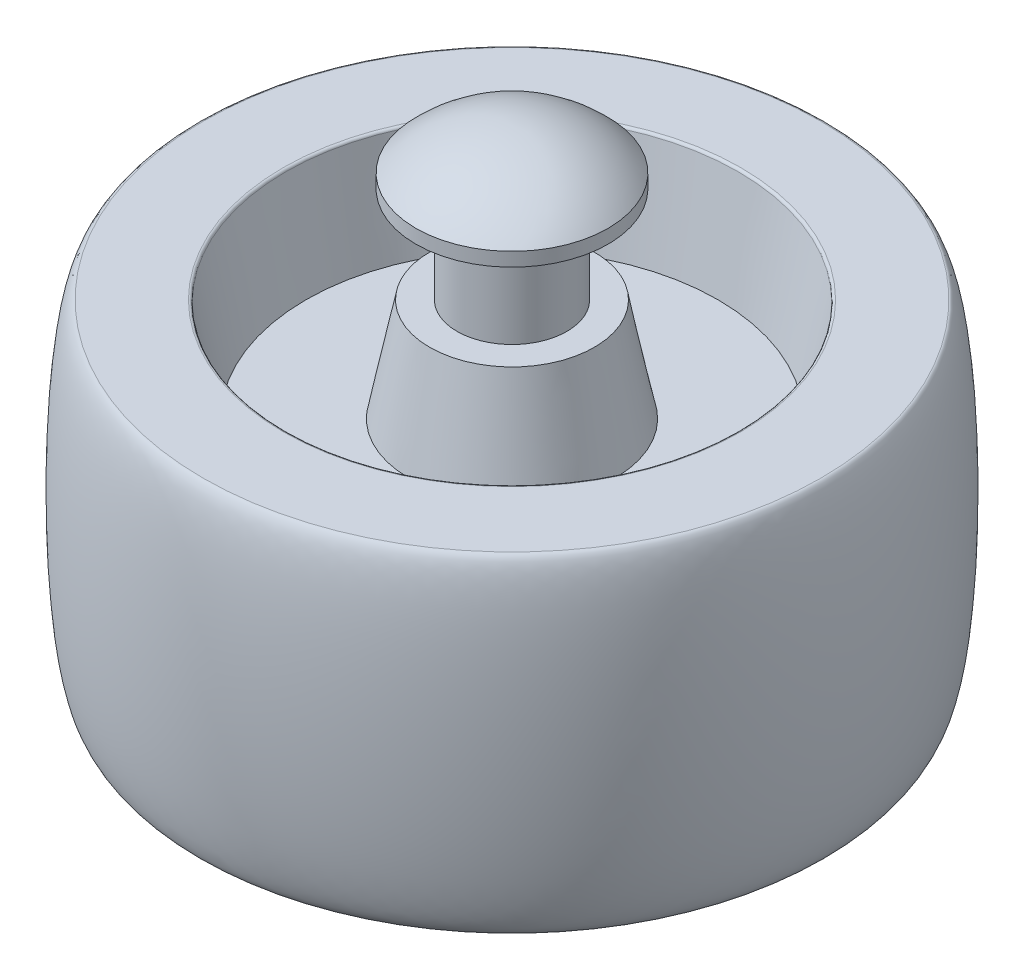
ISO-10303-21;
HEADER;
FILE_DESCRIPTION(('STEP AP214'),'2;1');
FILE_NAME('part.step','',(''),(''),'','','');
FILE_SCHEMA(('AUTOMOTIVE_DESIGN { 1 0 10303 214 1 1 1 1 }'));
ENDSEC;
DATA;
#1=APPLICATION_CONTEXT('core data for automotive mechanical design processes');
#2=APPLICATION_PROTOCOL_DEFINITION('international standard','automotive_design',2000,#1);
#3=PRODUCT_CONTEXT('',#1,'mechanical');
#4=PRODUCT('Part','Part','',(#3));
#5=PRODUCT_RELATED_PRODUCT_CATEGORY('part','',(#4));
#6=PRODUCT_DEFINITION_FORMATION('','',#4);
#7=PRODUCT_DEFINITION_CONTEXT('part definition',#1,'design');
#8=PRODUCT_DEFINITION('design','',#6,#7);
#9=PRODUCT_DEFINITION_SHAPE('','',#8);
#10=(LENGTH_UNIT() NAMED_UNIT(*) SI_UNIT(.MILLI.,.METRE.));
#11=(NAMED_UNIT(*) PLANE_ANGLE_UNIT() SI_UNIT($,.RADIAN.));
#12=(NAMED_UNIT(*) SI_UNIT($,.STERADIAN.) SOLID_ANGLE_UNIT());
#13=UNCERTAINTY_MEASURE_WITH_UNIT(LENGTH_MEASURE(1.E-05),#10,'distance_accuracy_value','');
#14=(GEOMETRIC_REPRESENTATION_CONTEXT(3) GLOBAL_UNCERTAINTY_ASSIGNED_CONTEXT((#13)) GLOBAL_UNIT_ASSIGNED_CONTEXT((#10,
#11,#12)) REPRESENTATION_CONTEXT('',''));
#15=CARTESIAN_POINT('',(0.,0.,0.));
#16=DIRECTION('',(0.,0.,1.));
#17=DIRECTION('',(1.,0.,0.));
#18=AXIS2_PLACEMENT_3D('',#15,#16,#17);
#19=CARTESIAN_POINT('',(0.,6.,0.));
#20=DIRECTION('',(0.,-1.,0.));
#21=DIRECTION('',(0.,0.,-1.));
#22=AXIS2_PLACEMENT_3D('',#19,#20,#21);
#23=PLANE('',#22);
#24=CARTESIAN_POINT('',(0.,6.,0.));
#25=DIRECTION('',(0.,1.,0.));
#26=DIRECTION('',(0.,0.,1.));
#27=AXIS2_PLACEMENT_3D('',#24,#25,#26);
#28=CIRCLE('',#27,2.);
#29=CARTESIAN_POINT('',(0.,6.,2.));
#30=VERTEX_POINT('',#29);
#31=EDGE_CURVE('E89',#30,#30,#28,.T.);
#32=ORIENTED_EDGE('',*,*,#31,.F.);
#33=EDGE_LOOP('',(#32));
#34=FACE_BOUND('',#33,.T.);
#35=CARTESIAN_POINT('',(0.,6.,0.));
#36=DIRECTION('',(0.,1.,0.));
#37=DIRECTION('',(0.,0.,1.));
#38=AXIS2_PLACEMENT_3D('',#35,#36,#37);
#39=CIRCLE('',#38,3.);
#40=CARTESIAN_POINT('',(0.,6.,3.));
#41=VERTEX_POINT('',#40);
#42=EDGE_CURVE('E86',#41,#41,#39,.T.);
#43=ORIENTED_EDGE('',*,*,#42,.T.);
#44=EDGE_LOOP('',(#43));
#45=FACE_BOUND('',#44,.T.);
#46=ADVANCED_FACE('F30',(#34,#45),#23,.F.);
#47=CARTESIAN_POINT('',(0.,-6.,0.));
#48=DIRECTION('',(0.,1.,0.));
#49=DIRECTION('',(0.,0.,1.));
#50=AXIS2_PLACEMENT_3D('',#47,#48,#49);
#51=PLANE('',#50);
#52=CARTESIAN_POINT('',(0.,-6.,0.));
#53=DIRECTION('',(0.,1.,0.));
#54=DIRECTION('',(0.,0.,1.));
#55=AXIS2_PLACEMENT_3D('',#52,#53,#54);
#56=CIRCLE('',#55,2.);
#57=CARTESIAN_POINT('',(0.,-6.,2.));
#58=VERTEX_POINT('',#57);
#59=EDGE_CURVE('E360',#58,#58,#56,.T.);
#60=ORIENTED_EDGE('',*,*,#59,.T.);
#61=EDGE_LOOP('',(#60));
#62=FACE_BOUND('',#61,.T.);
#63=CARTESIAN_POINT('',(0.,-6.,0.));
#64=DIRECTION('',(0.,1.,0.));
#65=DIRECTION('',(0.,0.,1.));
#66=AXIS2_PLACEMENT_3D('',#63,#64,#65);
#67=CIRCLE('',#66,3.);
#68=CARTESIAN_POINT('',(0.,-6.,3.));
#69=VERTEX_POINT('',#68);
#70=EDGE_CURVE('E65',#69,#69,#67,.T.);
#71=ORIENTED_EDGE('',*,*,#70,.F.);
#72=EDGE_LOOP('',(#71));
#73=FACE_BOUND('',#72,.T.);
#74=ADVANCED_FACE('F116',(#62,#73),#51,.F.);
#75=CARTESIAN_POINT('',(0.,-6.,0.));
#76=DIRECTION('',(0.,1.,0.));
#77=DIRECTION('',(0.,0.,1.));
#78=AXIS2_PLACEMENT_3D('',#75,#76,#77);
#79=CONICAL_SURFACE('',#78,3.,0.197395559849882);
#80=CARTESIAN_POINT('',(0.,-2.25,0.));
#81=DIRECTION('',(0.,1.,0.));
#82=DIRECTION('',(0.,0.,1.));
#83=AXIS2_PLACEMENT_3D('',#80,#81,#82);
#84=CIRCLE('',#83,3.75);
#85=CARTESIAN_POINT('',(0.,-2.25,3.75));
#86=VERTEX_POINT('',#85);
#87=EDGE_CURVE('E68',#86,#86,#84,.T.);
#88=ORIENTED_EDGE('',*,*,#87,.F.);
#89=EDGE_LOOP('',(#88));
#90=FACE_BOUND('',#89,.T.);
#91=ORIENTED_EDGE('',*,*,#70,.T.);
#92=EDGE_LOOP('',(#91));
#93=FACE_BOUND('',#92,.T.);
#94=ADVANCED_FACE('F112',(#90,#93),#79,.T.);
#95=CARTESIAN_POINT('',(3.75,-2.25,0.));
#96=DIRECTION('',(0.,1.,0.));
#97=DIRECTION('',(0.,0.,1.));
#98=AXIS2_PLACEMENT_3D('',#95,#96,#97);
#99=PLANE('',#98);
#100=CARTESIAN_POINT('',(0.,-2.25,0.));
#101=DIRECTION('',(0.,1.,0.));
#102=DIRECTION('',(0.,0.,1.));
#103=AXIS2_PLACEMENT_3D('',#100,#101,#102);
#104=CIRCLE('',#103,7.5);
#105=CARTESIAN_POINT('',(0.,-2.25,7.5));
#106=VERTEX_POINT('',#105);
#107=EDGE_CURVE('E71',#106,#106,#104,.T.);
#108=ORIENTED_EDGE('',*,*,#107,.F.);
#109=EDGE_LOOP('',(#108));
#110=FACE_BOUND('',#109,.T.);
#111=ORIENTED_EDGE('',*,*,#87,.T.);
#112=EDGE_LOOP('',(#111));
#113=FACE_BOUND('',#112,.T.);
#114=ADVANCED_FACE('F108',(#110,#113),#99,.F.);
#115=CARTESIAN_POINT('',(0.,-2.25,0.));
#116=DIRECTION('',(0.,-1.,0.));
#117=DIRECTION('',(0.,0.,-1.));
#118=AXIS2_PLACEMENT_3D('',#115,#116,#117);
#119=CONICAL_SURFACE('',#118,7.5,0.197395559849881);
#120=CARTESIAN_POINT('',(0.,-5.91961161351381,0.));
#121=DIRECTION('',(0.,1.,0.));
#122=DIRECTION('',(0.,0.,1.));
#123=AXIS2_PLACEMENT_3D('',#120,#121,#122);
#124=CIRCLE('',#123,8.23392232270276);
#125=CARTESIAN_POINT('',(0.,-5.91961161351381,8.23392232270276));
#126=VERTEX_POINT('',#125);
#127=EDGE_CURVE('E59',#126,#126,#124,.F.);
#128=ORIENTED_EDGE('',*,*,#127,.T.);
#129=EDGE_LOOP('',(#128));
#130=FACE_BOUND('',#129,.T.);
#131=ORIENTED_EDGE('',*,*,#107,.T.);
#132=EDGE_LOOP('',(#131));
#133=FACE_BOUND('',#132,.T.);
#134=ADVANCED_FACE('F104',(#130,#133),#119,.F.);
#135=CARTESIAN_POINT('',(8.25,-6.,0.));
#136=DIRECTION('',(0.,1.,0.));
#137=DIRECTION('',(0.,0.,1.));
#138=AXIS2_PLACEMENT_3D('',#135,#136,#137);
#139=PLANE('',#138);
#140=CARTESIAN_POINT('',(0.,-6.,0.));
#141=DIRECTION('',(0.,1.,0.));
#142=DIRECTION('',(0.,0.,1.));
#143=AXIS2_PLACEMENT_3D('',#140,#141,#142);
#144=CIRCLE('',#143,8.33198039027185);
#145=CARTESIAN_POINT('',(0.,-6.,8.33198039027185));
#146=VERTEX_POINT('',#145);
#147=EDGE_CURVE('E62',#146,#146,#144,.T.);
#148=ORIENTED_EDGE('',*,*,#147,.T.);
#149=EDGE_LOOP('',(#148));
#150=FACE_BOUND('',#149,.T.);
#151=CARTESIAN_POINT('',(0.,-6.,0.));
#152=DIRECTION('',(0.,1.,0.));
#153=DIRECTION('',(0.,0.,1.));
#154=AXIS2_PLACEMENT_3D('',#151,#152,#153);
#155=CIRCLE('',#154,11.25);
#156=CARTESIAN_POINT('',(0.,-6.,11.25));
#157=VERTEX_POINT('',#156);
#158=EDGE_CURVE('E74',#157,#157,#155,.T.);
#159=ORIENTED_EDGE('',*,*,#158,.F.);
#160=EDGE_LOOP('',(#159));
#161=FACE_BOUND('',#160,.T.);
#162=ADVANCED_FACE('F99',(#150,#161),#139,.F.);
#163=CARTESIAN_POINT('',(11.25,0.,0.));
#164=DIRECTION('',(0.,0.,1.));
#165=DIRECTION('',(0.,1.,0.));
#166=AXIS2_PLACEMENT_3D('',#163,#164,#165);
#167=ELLIPSE('',#166,6.,0.750000000000001);
#168=CARTESIAN_POINT('',(0.,6.,0.));
#169=DIRECTION('',(0.,1.,0.));
#170=AXIS1_PLACEMENT('',#168,#169);
#171=SURFACE_OF_REVOLUTION('',#167,#170);
#172=CARTESIAN_POINT('',(0.,6.,0.));
#173=DIRECTION('',(0.,1.,0.));
#174=DIRECTION('',(0.,0.,1.));
#175=AXIS2_PLACEMENT_3D('',#172,#173,#174);
#176=CIRCLE('',#175,11.25);
#177=CARTESIAN_POINT('',(0.,6.,11.25));
#178=VERTEX_POINT('',#177);
#179=EDGE_CURVE('E77',#178,#178,#176,.T.);
#180=ORIENTED_EDGE('',*,*,#179,.F.);
#181=EDGE_LOOP('',(#180));
#182=FACE_BOUND('',#181,.T.);
#183=ORIENTED_EDGE('',*,*,#158,.T.);
#184=EDGE_LOOP('',(#183));
#185=FACE_BOUND('',#184,.T.);
#186=ADVANCED_FACE('F94',(#182,#185),#171,.T.);
#187=CARTESIAN_POINT('',(8.25,6.,0.));
#188=DIRECTION('',(0.,-1.,0.));
#189=DIRECTION('',(0.,0.,-1.));
#190=AXIS2_PLACEMENT_3D('',#187,#188,#189);
#191=PLANE('',#190);
#192=CARTESIAN_POINT('',(0.,6.,0.));
#193=DIRECTION('',(0.,-1.,0.));
#194=DIRECTION('',(0.,0.,-1.));
#195=AXIS2_PLACEMENT_3D('',#192,#193,#194);
#196=CIRCLE('',#195,8.33198039027186);
#197=CARTESIAN_POINT('',(0.,6.,-8.33198039027186));
#198=VERTEX_POINT('',#197);
#199=EDGE_CURVE('E53',#198,#198,#196,.T.);
#200=ORIENTED_EDGE('',*,*,#199,.T.);
#201=EDGE_LOOP('',(#200));
#202=FACE_BOUND('',#201,.T.);
#203=ORIENTED_EDGE('',*,*,#179,.T.);
#204=EDGE_LOOP('',(#203));
#205=FACE_BOUND('',#204,.T.);
#206=ADVANCED_FACE('F98',(#202,#205),#191,.F.);
#207=CARTESIAN_POINT('',(0.,6.,0.));
#208=DIRECTION('',(0.,1.,0.));
#209=DIRECTION('',(0.,0.,1.));
#210=AXIS2_PLACEMENT_3D('',#207,#208,#209);
#211=CONICAL_SURFACE('',#210,8.25,0.197395559849881);
#212=CARTESIAN_POINT('',(0.,5.91961161351381,0.));
#213=DIRECTION('',(0.,-1.,0.));
#214=DIRECTION('',(0.,0.,-1.));
#215=AXIS2_PLACEMENT_3D('',#212,#213,#214);
#216=CIRCLE('',#215,8.23392232270277);
#217=CARTESIAN_POINT('',(0.,5.91961161351381,-8.23392232270277));
#218=VERTEX_POINT('',#217);
#219=EDGE_CURVE('E56',#218,#218,#216,.F.);
#220=ORIENTED_EDGE('',*,*,#219,.T.);
#221=EDGE_LOOP('',(#220));
#222=FACE_BOUND('',#221,.T.);
#223=CARTESIAN_POINT('',(0.,2.25,0.));
#224=DIRECTION('',(0.,1.,0.));
#225=DIRECTION('',(0.,0.,1.));
#226=AXIS2_PLACEMENT_3D('',#223,#224,#225);
#227=CIRCLE('',#226,7.5);
#228=CARTESIAN_POINT('',(0.,2.25,7.5));
#229=VERTEX_POINT('',#228);
#230=EDGE_CURVE('E80',#229,#229,#227,.T.);
#231=ORIENTED_EDGE('',*,*,#230,.F.);
#232=EDGE_LOOP('',(#231));
#233=FACE_BOUND('',#232,.T.);
#234=ADVANCED_FACE('F186',(#222,#233),#211,.F.);
#235=CARTESIAN_POINT('',(3.75,2.25,0.));
#236=DIRECTION('',(0.,-1.,0.));
#237=DIRECTION('',(0.,0.,-1.));
#238=AXIS2_PLACEMENT_3D('',#235,#236,#237);
#239=PLANE('',#238);
#240=CARTESIAN_POINT('',(0.,2.25,0.));
#241=DIRECTION('',(0.,1.,0.));
#242=DIRECTION('',(0.,0.,1.));
#243=AXIS2_PLACEMENT_3D('',#240,#241,#242);
#244=CIRCLE('',#243,3.75);
#245=CARTESIAN_POINT('',(0.,2.25,3.75));
#246=VERTEX_POINT('',#245);
#247=EDGE_CURVE('E83',#246,#246,#244,.T.);
#248=ORIENTED_EDGE('',*,*,#247,.F.);
#249=EDGE_LOOP('',(#248));
#250=FACE_BOUND('',#249,.T.);
#251=ORIENTED_EDGE('',*,*,#230,.T.);
#252=EDGE_LOOP('',(#251));
#253=FACE_BOUND('',#252,.T.);
#254=ADVANCED_FACE('F183',(#250,#253),#239,.F.);
#255=CARTESIAN_POINT('',(0.,2.25,0.));
#256=DIRECTION('',(0.,-1.,0.));
#257=DIRECTION('',(0.,0.,-1.));
#258=AXIS2_PLACEMENT_3D('',#255,#256,#257);
#259=CONICAL_SURFACE('',#258,3.75,0.197395559849881);
#260=ORIENTED_EDGE('',*,*,#42,.F.);
#261=EDGE_LOOP('',(#260));
#262=FACE_BOUND('',#261,.T.);
#263=ORIENTED_EDGE('',*,*,#247,.T.);
#264=EDGE_LOOP('',(#263));
#265=FACE_BOUND('',#264,.T.);
#266=ADVANCED_FACE('F180',(#262,#265),#259,.T.);
#267=CARTESIAN_POINT('',(0.,-14.8129381414282,0.));
#268=DIRECTION('',(0.,1.,0.));
#269=DIRECTION('',(0.,0.,1.));
#270=AXIS2_PLACEMENT_3D('',#267,#268,#269);
#271=CYLINDRICAL_SURFACE('',#270,2.);
#272=CARTESIAN_POINT('',(0.,-9.15435984030725,0.));
#273=DIRECTION('',(-0.00820676985655671,-0.999390827019096,-0.0339208460774402));
#274=DIRECTION('',(-0.235011140246955,0.034899496702501,-0.971365939844371));
#275=AXIS2_PLACEMENT_3D('',#272,#273,#274);
#276=ELLIPSE('',#275,2.00121908859764,2.);
#277=CARTESIAN_POINT('',(-0.470308779895303,-9.08451830132376,-1.94391606083015));
#278=VERTEX_POINT('',#277);
#279=EDGE_CURVE('E357',#278,#278,#276,.F.);
#280=ORIENTED_EDGE('',*,*,#279,.T.);
#281=EDGE_LOOP('',(#280));
#282=FACE_BOUND('',#281,.T.);
#283=ORIENTED_EDGE('',*,*,#59,.F.);
#284=EDGE_LOOP('',(#283));
#285=FACE_BOUND('',#284,.T.);
#286=ADVANCED_FACE('F177',(#282,#285),#271,.T.);
#287=CARTESIAN_POINT('',(0.,9.5,0.));
#288=DIRECTION('',(0.,1.,0.));
#289=DIRECTION('',(0.,0.,1.));
#290=AXIS2_PLACEMENT_3D('',#287,#288,#289);
#291=CIRCLE('',#290,2.);
#292=CARTESIAN_POINT('',(0.,9.5,2.));
#293=VERTEX_POINT('',#292);
#294=EDGE_CURVE('E361',#293,#293,#291,.T.);
#295=ORIENTED_EDGE('',*,*,#294,.F.);
#296=EDGE_LOOP('',(#295));
#297=FACE_BOUND('',#296,.T.);
#298=ORIENTED_EDGE('',*,*,#31,.T.);
#299=EDGE_LOOP('',(#298));
#300=FACE_BOUND('',#299,.T.);
#301=ADVANCED_FACE('F128',(#297,#300),#271,.T.);
#302=CARTESIAN_POINT('',(0.,-5.9,0.));
#303=DIRECTION('',(0.,1.,0.));
#304=DIRECTION('',(0.,0.,1.));
#305=AXIS2_PLACEMENT_3D('',#302,#303,#304);
#306=TOROIDAL_SURFACE('',#305,8.33198039027185,0.1);
#307=ORIENTED_EDGE('',*,*,#127,.F.);
#308=EDGE_LOOP('',(#307));
#309=FACE_BOUND('',#308,.T.);
#310=ORIENTED_EDGE('',*,*,#147,.F.);
#311=EDGE_LOOP('',(#310));
#312=FACE_BOUND('',#311,.T.);
#313=ADVANCED_FACE('F124',(#309,#312),#306,.T.);
#314=CARTESIAN_POINT('',(0.,5.9,0.));
#315=DIRECTION('',(0.,-1.,0.));
#316=DIRECTION('',(0.,0.,-1.));
#317=AXIS2_PLACEMENT_3D('',#314,#315,#316);
#318=TOROIDAL_SURFACE('',#317,8.33198039027186,0.1);
#319=ORIENTED_EDGE('',*,*,#199,.F.);
#320=EDGE_LOOP('',(#319));
#321=FACE_BOUND('',#320,.T.);
#322=ORIENTED_EDGE('',*,*,#219,.F.);
#323=EDGE_LOOP('',(#322));
#324=FACE_BOUND('',#323,.T.);
#325=ADVANCED_FACE('F127',(#321,#324),#318,.T.);
#326=CARTESIAN_POINT('',(0.,10.,0.));
#327=DIRECTION('',(0.,-1.,0.));
#328=DIRECTION('',(0.,0.,-1.));
#329=AXIS2_PLACEMENT_3D('',#326,#327,#328);
#330=CYLINDRICAL_SURFACE('',#329,3.5);
#331=CARTESIAN_POINT('',(0.,10.,0.));
#332=DIRECTION('',(0.,1.,0.));
#333=DIRECTION('',(0.,0.,1.));
#334=AXIS2_PLACEMENT_3D('',#331,#332,#333);
#335=CIRCLE('',#334,3.5);
#336=CARTESIAN_POINT('',(0.,10.,3.5));
#337=VERTEX_POINT('',#336);
#338=EDGE_CURVE('E364',#337,#337,#335,.T.);
#339=ORIENTED_EDGE('',*,*,#338,.F.);
#340=EDGE_LOOP('',(#339));
#341=FACE_BOUND('',#340,.T.);
#342=CARTESIAN_POINT('',(0.,9.5,0.));
#343=DIRECTION('',(0.,1.,0.));
#344=DIRECTION('',(0.,0.,1.));
#345=AXIS2_PLACEMENT_3D('',#342,#343,#344);
#346=CIRCLE('',#345,3.5);
#347=CARTESIAN_POINT('',(0.,9.5,3.5));
#348=VERTEX_POINT('',#347);
#349=EDGE_CURVE('E367',#348,#348,#346,.T.);
#350=ORIENTED_EDGE('',*,*,#349,.T.);
#351=EDGE_LOOP('',(#350));
#352=FACE_BOUND('',#351,.T.);
#353=ADVANCED_FACE('F131',(#341,#352),#330,.T.);
#354=CARTESIAN_POINT('',(0.,9.5,0.));
#355=DIRECTION('',(0.,1.,0.));
#356=DIRECTION('',(0.,0.,1.));
#357=AXIS2_PLACEMENT_3D('',#354,#355,#356);
#358=PLANE('',#357);
#359=ORIENTED_EDGE('',*,*,#294,.T.);
#360=EDGE_LOOP('',(#359));
#361=FACE_BOUND('',#360,.T.);
#362=ORIENTED_EDGE('',*,*,#349,.F.);
#363=EDGE_LOOP('',(#362));
#364=FACE_BOUND('',#363,.T.);
#365=ADVANCED_FACE('F163',(#361,#364),#358,.F.);
#366=CARTESIAN_POINT('',(0.,6.66666666666666,0.));
#367=DIRECTION('',(0.,-1.,0.));
#368=DIRECTION('',(1.,0.,0.));
#369=AXIS2_PLACEMENT_3D('',#366,#367,#368);
#370=SPHERICAL_SURFACE('',#369,4.83333333333334);
#371=ORIENTED_EDGE('',*,*,#338,.T.);
#372=EDGE_LOOP('',(#371));
#373=FACE_BOUND('',#372,.T.);
#374=ADVANCED_FACE('F152',(#373),#370,.T.);
#375=CARTESIAN_POINT('',(-0.0791853435419678,-9.64290547357956,-0.327294891513296));
#376=DIRECTION('',(-0.00820676985655671,-0.999390827019096,-0.0339208460774402));
#377=DIRECTION('',(0.,0.0339219884378093,-0.99942448374073));
#378=AXIS2_PLACEMENT_3D('',#375,#376,#377);
#379=PLANE('',#378);
#380=CARTESIAN_POINT('',(-0.0791853435419678,-9.64290547357956,-0.327294891513296));
#381=DIRECTION('',(-0.00820676985655671,-0.999390827019096,-0.0339208460774402));
#382=DIRECTION('',(0.,0.0339219884378093,-0.99942448374073));
#383=AXIS2_PLACEMENT_3D('',#380,#381,#382);
#384=CIRCLE('',#383,2.6);
#385=CARTESIAN_POINT('',(-0.0791853435419678,-9.55470830364126,-2.92579854923919));
#386=VERTEX_POINT('',#385);
#387=EDGE_CURVE('E41',#386,#386,#384,.T.);
#388=ORIENTED_EDGE('',*,*,#387,.T.);
#389=EDGE_LOOP('',(#388));
#390=FACE_BOUND('',#389,.T.);
#391=CARTESIAN_POINT('',(-0.0791853435419678,-9.64290547357956,-0.327294891513296));
#392=DIRECTION('',(-0.00820676985655671,-0.999390827019096,-0.0339208460774402));
#393=DIRECTION('',(0.,0.0339219884378093,-0.99942448374073));
#394=AXIS2_PLACEMENT_3D('',#391,#392,#393);
#395=CIRCLE('',#394,1.9);
#396=CARTESIAN_POINT('',(-0.0791853435419678,-9.57845369554773,-2.22620141062068));
#397=VERTEX_POINT('',#396);
#398=EDGE_CURVE('E45',#397,#397,#395,.F.);
#399=ORIENTED_EDGE('',*,*,#398,.T.);
#400=EDGE_LOOP('',(#399));
#401=FACE_BOUND('',#400,.T.);
#402=ADVANCED_FACE('F148',(#390,#401),#379,.T.);
#403=CARTESIAN_POINT('',(-0.0750819586136895,-9.14321006007002,-0.310334468474576));
#404=DIRECTION('',(-0.00820676985655671,-0.999390827019096,-0.0339208460774402));
#405=DIRECTION('',(0.,0.0339219884378093,-0.99942448374073));
#406=AXIS2_PLACEMENT_3D('',#403,#404,#405);
#407=PLANE('',#406);
#408=ORIENTED_EDGE('',*,*,#279,.F.);
#409=EDGE_LOOP('',(#408));
#410=FACE_BOUND('',#409,.T.);
#411=CARTESIAN_POINT('',(-0.0750819586136895,-9.14321006007002,-0.310334468474576));
#412=DIRECTION('',(-0.00820676985655671,-0.999390827019096,-0.0339208460774402));
#413=DIRECTION('',(0.,0.0339219884378093,-0.99942448374073));
#414=AXIS2_PLACEMENT_3D('',#411,#412,#413);
#415=CIRCLE('',#414,3.);
#416=CARTESIAN_POINT('',(-0.0750819586136895,-9.04144409475659,-3.30860791969677));
#417=VERTEX_POINT('',#416);
#418=EDGE_CURVE('E373',#417,#417,#415,.T.);
#419=ORIENTED_EDGE('',*,*,#418,.F.);
#420=EDGE_LOOP('',(#419));
#421=FACE_BOUND('',#420,.T.);
#422=ADVANCED_FACE('F151',(#410,#421),#407,.F.);
#423=CARTESIAN_POINT('',(-0.0791853435419678,-9.64290547357956,-0.327294891513296));
#424=DIRECTION('',(0.00820676985655671,0.999390827019096,0.0339208460774402));
#425=DIRECTION('',(0.,-0.0339219884378093,0.99942448374073));
#426=AXIS2_PLACEMENT_3D('',#423,#424,#425);
#427=CYLINDRICAL_SURFACE('',#426,3.);
#428=CARTESIAN_POINT('',(-0.0759026355993452,-9.24314914277193,-0.31372655308232));
#429=DIRECTION('',(-0.00820676985655671,-0.999390827019096,-0.0339208460774402));
#430=DIRECTION('',(0.,0.0339219884378093,-0.99942448374073));
#431=AXIS2_PLACEMENT_3D('',#428,#429,#430);
#432=CIRCLE('',#431,3.);
#433=CARTESIAN_POINT('',(-0.0759026355993452,-9.1413831774585,-3.31200000430451));
#434=VERTEX_POINT('',#433);
#435=EDGE_CURVE('E37',#434,#434,#432,.F.);
#436=ORIENTED_EDGE('',*,*,#435,.T.);
#437=EDGE_LOOP('',(#436));
#438=FACE_BOUND('',#437,.T.);
#439=ORIENTED_EDGE('',*,*,#418,.T.);
#440=EDGE_LOOP('',(#439));
#441=FACE_BOUND('',#440,.T.);
#442=ADVANCED_FACE('F160',(#438,#441),#427,.T.);
#443=CARTESIAN_POINT('',(-0.0791853435419678,-9.64290547357956,-0.327294891513296));
#444=DIRECTION('',(0.00820676985655671,0.999390827019096,0.0339208460774402));
#445=DIRECTION('',(0.,-0.0339219884378093,0.99942448374073));
#446=AXIS2_PLACEMENT_3D('',#443,#444,#445);
#447=CYLINDRICAL_SURFACE('',#446,1.5);
#448=CARTESIAN_POINT('',(-0.0759026355993452,-9.24314914277193,-0.31372655308232));
#449=DIRECTION('',(-0.00820676985655671,-0.999390827019096,-0.0339208460774402));
#450=DIRECTION('',(0.,0.0339219884378093,-0.99942448374073));
#451=AXIS2_PLACEMENT_3D('',#448,#449,#450);
#452=CIRCLE('',#451,1.5);
#453=CARTESIAN_POINT('',(-0.0759026355993452,-9.19226616011521,-1.81286327869342));
#454=VERTEX_POINT('',#453);
#455=EDGE_CURVE('E10',#454,#454,#452,.T.);
#456=ORIENTED_EDGE('',*,*,#455,.T.);
#457=EDGE_LOOP('',(#456));
#458=FACE_BOUND('',#457,.T.);
#459=CARTESIAN_POINT('',(-0.0750819586136895,-9.14321006007001,-0.310334468474576));
#460=DIRECTION('',(-0.00820676985655671,-0.999390827019096,-0.0339208460774402));
#461=DIRECTION('',(0.,0.0339219884378093,-0.99942448374073));
#462=AXIS2_PLACEMENT_3D('',#459,#460,#461);
#463=CIRCLE('',#462,1.5);
#464=CARTESIAN_POINT('',(-0.0750819586136895,-9.0923270774133,-1.80947119408567));
#465=VERTEX_POINT('',#464);
#466=EDGE_CURVE('E50',#465,#465,#463,.F.);
#467=ORIENTED_EDGE('',*,*,#466,.T.);
#468=EDGE_LOOP('',(#467));
#469=FACE_BOUND('',#468,.T.);
#470=ADVANCED_FACE('F142',(#458,#469),#447,.F.);
#471=CARTESIAN_POINT('',(-0.883756515666599,-8.49725851281503,-19.1459921519001));
#472=DIRECTION('',(-0.00820676985655671,-0.999390827019096,-0.0339208460774402));
#473=DIRECTION('',(-0.235011140246969,0.034899496702501,-0.971365939844368));
#474=AXIS2_PLACEMENT_3D('',#471,#472,#473);
#475=PLANE('',#474);
#476=ORIENTED_EDGE('',*,*,#466,.F.);
#477=EDGE_LOOP('',(#476));
#478=FACE_BOUND('',#477,.T.);
#479=ADVANCED_FACE('F135',(#478),#475,.T.);
#480=CARTESIAN_POINT('',(-0.0759026355993452,-9.24314914277193,-0.31372655308232));
#481=DIRECTION('',(-0.00820676985655671,-0.999390827019096,-0.0339208460774402));
#482=DIRECTION('',(0.,0.0339219884378093,-0.99942448374073));
#483=AXIS2_PLACEMENT_3D('',#480,#481,#482);
#484=TOROIDAL_SURFACE('',#483,2.6,0.4);
#485=ORIENTED_EDGE('',*,*,#435,.F.);
#486=EDGE_LOOP('',(#485));
#487=FACE_BOUND('',#486,.T.);
#488=ORIENTED_EDGE('',*,*,#387,.F.);
#489=EDGE_LOOP('',(#488));
#490=FACE_BOUND('',#489,.T.);
#491=ADVANCED_FACE('F133',(#487,#490),#484,.T.);
#492=CARTESIAN_POINT('',(-0.0759026355993452,-9.24314914277193,-0.31372655308232));
#493=DIRECTION('',(-0.00820676985655671,-0.999390827019096,-0.0339208460774402));
#494=DIRECTION('',(0.,0.0339219884378093,-0.99942448374073));
#495=AXIS2_PLACEMENT_3D('',#492,#493,#494);
#496=TOROIDAL_SURFACE('',#495,1.9,0.4);
#497=ORIENTED_EDGE('',*,*,#398,.F.);
#498=EDGE_LOOP('',(#497));
#499=FACE_BOUND('',#498,.T.);
#500=ORIENTED_EDGE('',*,*,#455,.F.);
#501=EDGE_LOOP('',(#500));
#502=FACE_BOUND('',#501,.T.);
#503=ADVANCED_FACE('F32',(#499,#502),#496,.T.);
#504=CLOSED_SHELL('',(#46,#74,#94,#114,#134,#162,#186,#206,#234,#254,#266,#286,#301,#313,#325,
#353,#365,#374,#402,#422,#442,#470,#479,#491,#503));
#505=MANIFOLD_SOLID_BREP('B2',#504);
#506=ADVANCED_BREP_SHAPE_REPRESENTATION('',(#18,#505),#14);
#507=SHAPE_DEFINITION_REPRESENTATION(#9,#506);
ENDSEC;
END-ISO-10303-21;
